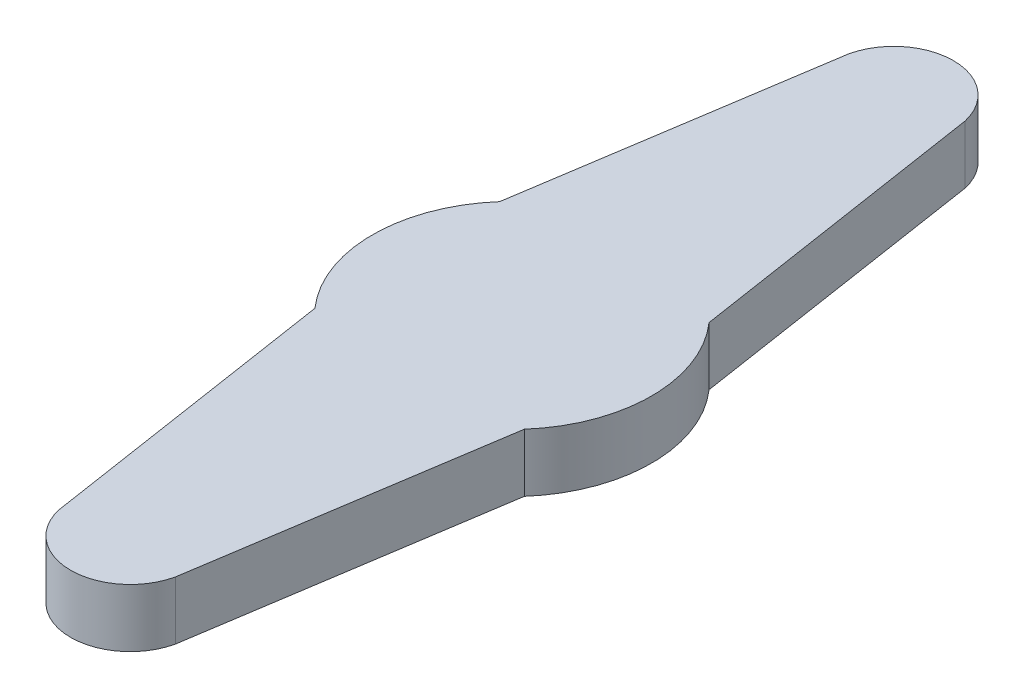
ISO-10303-21;
HEADER;
FILE_DESCRIPTION(('STEP AP214'),'2;1');
FILE_NAME('part.step','',(''),(''),'','','');
FILE_SCHEMA(('AUTOMOTIVE_DESIGN { 1 0 10303 214 1 1 1 1 }'));
ENDSEC;
DATA;
#1=APPLICATION_CONTEXT('core data for automotive mechanical design processes');
#2=APPLICATION_PROTOCOL_DEFINITION('international standard','automotive_design',2000,#1);
#3=PRODUCT_CONTEXT('',#1,'mechanical');
#4=PRODUCT('Part','Part','',(#3));
#5=PRODUCT_RELATED_PRODUCT_CATEGORY('part','',(#4));
#6=PRODUCT_DEFINITION_FORMATION('','',#4);
#7=PRODUCT_DEFINITION_CONTEXT('part definition',#1,'design');
#8=PRODUCT_DEFINITION('design','',#6,#7);
#9=PRODUCT_DEFINITION_SHAPE('','',#8);
#10=(LENGTH_UNIT() NAMED_UNIT(*) SI_UNIT(.MILLI.,.METRE.));
#11=(NAMED_UNIT(*) PLANE_ANGLE_UNIT() SI_UNIT($,.RADIAN.));
#12=(NAMED_UNIT(*) SI_UNIT($,.STERADIAN.) SOLID_ANGLE_UNIT());
#13=UNCERTAINTY_MEASURE_WITH_UNIT(LENGTH_MEASURE(1.E-05),#10,'distance_accuracy_value','');
#14=(GEOMETRIC_REPRESENTATION_CONTEXT(3) GLOBAL_UNCERTAINTY_ASSIGNED_CONTEXT((#13)) GLOBAL_UNIT_ASSIGNED_CONTEXT((#10,
#11,#12)) REPRESENTATION_CONTEXT('',''));
#15=CARTESIAN_POINT('',(0.,0.,0.));
#16=DIRECTION('',(0.,0.,1.));
#17=DIRECTION('',(1.,0.,0.));
#18=AXIS2_PLACEMENT_3D('',#15,#16,#17);
#19=CARTESIAN_POINT('',(0.,2.5,-16.4061269665969));
#20=DIRECTION('',(0.,-1.,0.));
#21=DIRECTION('',(0.,0.,-1.));
#22=AXIS2_PLACEMENT_3D('',#19,#20,#21);
#23=CYLINDRICAL_SURFACE('',#22,2.5625);
#24=CARTESIAN_POINT('',(0.,0.,-16.4061269665969));
#25=DIRECTION('',(0.,-1.,0.));
#26=DIRECTION('',(0.,0.,-1.));
#27=AXIS2_PLACEMENT_3D('',#24,#25,#26);
#28=CIRCLE('',#27,2.5625);
#29=CARTESIAN_POINT('',(-2.5,0.,-16.9686269665969));
#30=VERTEX_POINT('',#29);
#31=CARTESIAN_POINT('',(2.5,0.,-16.9686269665969));
#32=VERTEX_POINT('',#31);
#33=EDGE_CURVE('E147',#30,#32,#28,.T.);
#34=ORIENTED_EDGE('',*,*,#33,.F.);
#35=DIRECTION('',(0.,-1.,0.));
#36=VECTOR('',#35,1.);
#37=CARTESIAN_POINT('',(-2.5,2.5,-16.9686269665969));
#38=LINE('',#37,#36);
#39=CARTESIAN_POINT('',(-2.5,2.5,-16.9686269665969));
#40=VERTEX_POINT('',#39);
#41=EDGE_CURVE('E11',#40,#30,#38,.T.);
#42=ORIENTED_EDGE('',*,*,#41,.F.);
#43=CARTESIAN_POINT('',(0.,2.5,-16.4061269665969));
#44=DIRECTION('',(0.,-1.,0.));
#45=DIRECTION('',(0.,0.,-1.));
#46=AXIS2_PLACEMENT_3D('',#43,#44,#45);
#47=CIRCLE('',#46,2.5625);
#48=CARTESIAN_POINT('',(2.5,2.5,-16.9686269665969));
#49=VERTEX_POINT('',#48);
#50=EDGE_CURVE('E171',#40,#49,#47,.T.);
#51=ORIENTED_EDGE('',*,*,#50,.T.);
#52=DIRECTION('',(0.,-1.,0.));
#53=VECTOR('',#52,1.);
#54=CARTESIAN_POINT('',(2.5,2.5,-16.9686269665969));
#55=LINE('',#54,#53);
#56=EDGE_CURVE('E46',#49,#32,#55,.T.);
#57=ORIENTED_EDGE('',*,*,#56,.T.);
#58=EDGE_LOOP('',(#34,#42,#51,#57));
#59=FACE_BOUND('',#58,.T.);
#60=ADVANCED_FACE('F43',(#59),#23,.T.);
#61=CARTESIAN_POINT('',(-2.5,2.5,-16.9686269665969));
#62=DIRECTION('',(0.988371697650617,0.,0.152057184253941));
#63=DIRECTION('',(0.152057184253941,0.,-0.988371697650617));
#64=AXIS2_PLACEMENT_3D('',#61,#62,#63);
#65=PLANE('',#64);
#66=DIRECTION('',(-0.152057184253941,0.,0.988371697650617));
#67=VECTOR('',#66,1.);
#68=CARTESIAN_POINT('',(-2.5,0.,-16.9686269665969));
#69=LINE('',#68,#67);
#70=CARTESIAN_POINT('',(-4.5,0.,-3.96862696659689));
#71=VERTEX_POINT('',#70);
#72=EDGE_CURVE('E89',#30,#71,#69,.T.);
#73=ORIENTED_EDGE('',*,*,#72,.T.);
#74=DIRECTION('',(0.,-1.,0.));
#75=VECTOR('',#74,1.);
#76=CARTESIAN_POINT('',(-4.5,2.5,-3.96862696659689));
#77=LINE('',#76,#75);
#78=CARTESIAN_POINT('',(-4.5,2.5,-3.96862696659689));
#79=VERTEX_POINT('',#78);
#80=EDGE_CURVE('E53',#79,#71,#77,.T.);
#81=ORIENTED_EDGE('',*,*,#80,.F.);
#82=DIRECTION('',(-0.152057184253941,0.,0.988371697650617));
#83=VECTOR('',#82,1.);
#84=CARTESIAN_POINT('',(-2.5,2.5,-16.9686269665969));
#85=LINE('',#84,#83);
#86=EDGE_CURVE('E120',#40,#79,#85,.T.);
#87=ORIENTED_EDGE('',*,*,#86,.F.);
#88=ORIENTED_EDGE('',*,*,#41,.T.);
#89=EDGE_LOOP('',(#73,#81,#87,#88));
#90=FACE_BOUND('',#89,.T.);
#91=ADVANCED_FACE('F221',(#90),#65,.F.);
#92=CARTESIAN_POINT('',(0.,2.5,0.));
#93=DIRECTION('',(0.,-1.,0.));
#94=DIRECTION('',(0.,0.,-1.));
#95=AXIS2_PLACEMENT_3D('',#92,#93,#94);
#96=CYLINDRICAL_SURFACE('',#95,6.);
#97=CARTESIAN_POINT('',(0.,0.,0.));
#98=DIRECTION('',(0.,1.,0.));
#99=DIRECTION('',(0.,0.,1.));
#100=AXIS2_PLACEMENT_3D('',#97,#98,#99);
#101=CIRCLE('',#100,6.);
#102=CARTESIAN_POINT('',(-4.5,0.,3.96862696659689));
#103=VERTEX_POINT('',#102);
#104=EDGE_CURVE('E128',#71,#103,#101,.T.);
#105=ORIENTED_EDGE('',*,*,#104,.T.);
#106=DIRECTION('',(0.,-1.,0.));
#107=VECTOR('',#106,1.);
#108=CARTESIAN_POINT('',(-4.5,2.5,3.96862696659689));
#109=LINE('',#108,#107);
#110=CARTESIAN_POINT('',(-4.5,2.5,3.96862696659689));
#111=VERTEX_POINT('',#110);
#112=EDGE_CURVE('E125',#111,#103,#109,.T.);
#113=ORIENTED_EDGE('',*,*,#112,.F.);
#114=CARTESIAN_POINT('',(0.,2.5,0.));
#115=DIRECTION('',(0.,1.,0.));
#116=DIRECTION('',(0.,0.,1.));
#117=AXIS2_PLACEMENT_3D('',#114,#115,#116);
#118=CIRCLE('',#117,6.);
#119=EDGE_CURVE('E114',#79,#111,#118,.T.);
#120=ORIENTED_EDGE('',*,*,#119,.F.);
#121=ORIENTED_EDGE('',*,*,#80,.T.);
#122=EDGE_LOOP('',(#105,#113,#120,#121));
#123=FACE_BOUND('',#122,.T.);
#124=ADVANCED_FACE('F126',(#123),#96,.T.);
#125=CARTESIAN_POINT('',(-2.5,2.5,16.9686269665969));
#126=DIRECTION('',(-0.988371697650617,0.,0.152057184253941));
#127=DIRECTION('',(0.152057184253941,0.,0.988371697650617));
#128=AXIS2_PLACEMENT_3D('',#125,#126,#127);
#129=PLANE('',#128);
#130=DIRECTION('',(-0.152057184253941,0.,-0.988371697650617));
#131=VECTOR('',#130,1.);
#132=CARTESIAN_POINT('',(-2.5,0.,16.9686269665969));
#133=LINE('',#132,#131);
#134=CARTESIAN_POINT('',(-2.5,0.,16.9686269665969));
#135=VERTEX_POINT('',#134);
#136=EDGE_CURVE('E165',#135,#103,#133,.T.);
#137=ORIENTED_EDGE('',*,*,#136,.F.);
#138=DIRECTION('',(0.,-1.,0.));
#139=VECTOR('',#138,1.);
#140=CARTESIAN_POINT('',(-2.5,2.5,16.9686269665969));
#141=LINE('',#140,#139);
#142=CARTESIAN_POINT('',(-2.5,2.5,16.9686269665969));
#143=VERTEX_POINT('',#142);
#144=EDGE_CURVE('E133',#143,#135,#141,.T.);
#145=ORIENTED_EDGE('',*,*,#144,.F.);
#146=DIRECTION('',(-0.152057184253941,0.,-0.988371697650617));
#147=VECTOR('',#146,1.);
#148=CARTESIAN_POINT('',(-2.5,2.5,16.9686269665969));
#149=LINE('',#148,#147);
#150=EDGE_CURVE('E119',#143,#111,#149,.T.);
#151=ORIENTED_EDGE('',*,*,#150,.T.);
#152=ORIENTED_EDGE('',*,*,#112,.T.);
#153=EDGE_LOOP('',(#137,#145,#151,#152));
#154=FACE_BOUND('',#153,.T.);
#155=ADVANCED_FACE('F135',(#154),#129,.T.);
#156=CARTESIAN_POINT('',(0.,2.5,16.4061269665969));
#157=DIRECTION('',(0.,-1.,0.));
#158=DIRECTION('',(0.,0.,-1.));
#159=AXIS2_PLACEMENT_3D('',#156,#157,#158);
#160=CYLINDRICAL_SURFACE('',#159,2.5625);
#161=CARTESIAN_POINT('',(0.,0.,16.4061269665969));
#162=DIRECTION('',(0.,1.,0.));
#163=DIRECTION('',(0.,0.,1.));
#164=AXIS2_PLACEMENT_3D('',#161,#162,#163);
#165=CIRCLE('',#164,2.5625);
#166=CARTESIAN_POINT('',(2.5,0.,16.9686269665969));
#167=VERTEX_POINT('',#166);
#168=EDGE_CURVE('E162',#135,#167,#165,.T.);
#169=ORIENTED_EDGE('',*,*,#168,.T.);
#170=DIRECTION('',(0.,-1.,0.));
#171=VECTOR('',#170,1.);
#172=CARTESIAN_POINT('',(2.5,2.5,16.9686269665969));
#173=LINE('',#172,#171);
#174=CARTESIAN_POINT('',(2.5,2.5,16.9686269665969));
#175=VERTEX_POINT('',#174);
#176=EDGE_CURVE('E177',#175,#167,#173,.T.);
#177=ORIENTED_EDGE('',*,*,#176,.F.);
#178=CARTESIAN_POINT('',(0.,2.5,16.4061269665969));
#179=DIRECTION('',(0.,1.,0.));
#180=DIRECTION('',(0.,0.,1.));
#181=AXIS2_PLACEMENT_3D('',#178,#179,#180);
#182=CIRCLE('',#181,2.5625);
#183=EDGE_CURVE('E138',#143,#175,#182,.T.);
#184=ORIENTED_EDGE('',*,*,#183,.F.);
#185=ORIENTED_EDGE('',*,*,#144,.T.);
#186=EDGE_LOOP('',(#169,#177,#184,#185));
#187=FACE_BOUND('',#186,.T.);
#188=ADVANCED_FACE('F196',(#187),#160,.T.);
#189=CARTESIAN_POINT('',(2.5,2.5,16.9686269665969));
#190=DIRECTION('',(-0.988371697650617,0.,-0.152057184253941));
#191=DIRECTION('',(-0.152057184253941,0.,0.988371697650617));
#192=AXIS2_PLACEMENT_3D('',#189,#190,#191);
#193=PLANE('',#192);
#194=DIRECTION('',(0.152057184253941,0.,-0.988371697650617));
#195=VECTOR('',#194,1.);
#196=CARTESIAN_POINT('',(2.5,0.,16.9686269665969));
#197=LINE('',#196,#195);
#198=CARTESIAN_POINT('',(4.5,0.,3.96862696659689));
#199=VERTEX_POINT('',#198);
#200=EDGE_CURVE('E159',#167,#199,#197,.T.);
#201=ORIENTED_EDGE('',*,*,#200,.T.);
#202=DIRECTION('',(0.,-1.,0.));
#203=VECTOR('',#202,1.);
#204=CARTESIAN_POINT('',(4.5,2.5,3.96862696659689));
#205=LINE('',#204,#203);
#206=CARTESIAN_POINT('',(4.5,2.5,3.96862696659689));
#207=VERTEX_POINT('',#206);
#208=EDGE_CURVE('E181',#207,#199,#205,.T.);
#209=ORIENTED_EDGE('',*,*,#208,.F.);
#210=DIRECTION('',(0.152057184253941,0.,-0.988371697650617));
#211=VECTOR('',#210,1.);
#212=CARTESIAN_POINT('',(2.5,2.5,16.9686269665969));
#213=LINE('',#212,#211);
#214=EDGE_CURVE('E141',#175,#207,#213,.T.);
#215=ORIENTED_EDGE('',*,*,#214,.F.);
#216=ORIENTED_EDGE('',*,*,#176,.T.);
#217=EDGE_LOOP('',(#201,#209,#215,#216));
#218=FACE_BOUND('',#217,.T.);
#219=ADVANCED_FACE('F199',(#218),#193,.F.);
#220=CARTESIAN_POINT('',(0.,2.5,0.));
#221=DIRECTION('',(0.,-1.,0.));
#222=DIRECTION('',(0.,0.,-1.));
#223=AXIS2_PLACEMENT_3D('',#220,#221,#222);
#224=CYLINDRICAL_SURFACE('',#223,6.);
#225=CARTESIAN_POINT('',(0.,0.,0.));
#226=DIRECTION('',(0.,1.,0.));
#227=DIRECTION('',(0.,0.,1.));
#228=AXIS2_PLACEMENT_3D('',#225,#226,#227);
#229=CIRCLE('',#228,6.);
#230=CARTESIAN_POINT('',(4.5,0.,-3.96862696659689));
#231=VERTEX_POINT('',#230);
#232=EDGE_CURVE('E155',#199,#231,#229,.T.);
#233=ORIENTED_EDGE('',*,*,#232,.T.);
#234=DIRECTION('',(0.,-1.,0.));
#235=VECTOR('',#234,1.);
#236=CARTESIAN_POINT('',(4.5,2.5,-3.96862696659689));
#237=LINE('',#236,#235);
#238=CARTESIAN_POINT('',(4.5,2.5,-3.96862696659689));
#239=VERTEX_POINT('',#238);
#240=EDGE_CURVE('E184',#239,#231,#237,.T.);
#241=ORIENTED_EDGE('',*,*,#240,.F.);
#242=CARTESIAN_POINT('',(0.,2.5,0.));
#243=DIRECTION('',(0.,1.,0.));
#244=DIRECTION('',(0.,0.,1.));
#245=AXIS2_PLACEMENT_3D('',#242,#243,#244);
#246=CIRCLE('',#245,6.);
#247=EDGE_CURVE('E203',#207,#239,#246,.T.);
#248=ORIENTED_EDGE('',*,*,#247,.F.);
#249=ORIENTED_EDGE('',*,*,#208,.T.);
#250=EDGE_LOOP('',(#233,#241,#248,#249));
#251=FACE_BOUND('',#250,.T.);
#252=ADVANCED_FACE('F212',(#251),#224,.T.);
#253=CARTESIAN_POINT('',(2.5,2.5,-16.9686269665969));
#254=DIRECTION('',(0.988371697650617,0.,-0.152057184253941));
#255=DIRECTION('',(-0.152057184253941,0.,-0.988371697650617));
#256=AXIS2_PLACEMENT_3D('',#253,#254,#255);
#257=PLANE('',#256);
#258=DIRECTION('',(0.152057184253941,0.,0.988371697650617));
#259=VECTOR('',#258,1.);
#260=CARTESIAN_POINT('',(2.5,0.,-16.9686269665969));
#261=LINE('',#260,#259);
#262=EDGE_CURVE('E151',#32,#231,#261,.T.);
#263=ORIENTED_EDGE('',*,*,#262,.F.);
#264=ORIENTED_EDGE('',*,*,#56,.F.);
#265=DIRECTION('',(0.152057184253941,0.,0.988371697650617));
#266=VECTOR('',#265,1.);
#267=CARTESIAN_POINT('',(2.5,2.5,-16.9686269665969));
#268=LINE('',#267,#266);
#269=EDGE_CURVE('E205',#49,#239,#268,.T.);
#270=ORIENTED_EDGE('',*,*,#269,.T.);
#271=ORIENTED_EDGE('',*,*,#240,.T.);
#272=EDGE_LOOP('',(#263,#264,#270,#271));
#273=FACE_BOUND('',#272,.T.);
#274=ADVANCED_FACE('F188',(#273),#257,.T.);
#275=CARTESIAN_POINT('',(0.,2.5,-16.4061269665969));
#276=DIRECTION('',(0.,-1.,0.));
#277=DIRECTION('',(0.,0.,-1.));
#278=AXIS2_PLACEMENT_3D('',#275,#276,#277);
#279=PLANE('',#278);
#280=ORIENTED_EDGE('',*,*,#50,.F.);
#281=ORIENTED_EDGE('',*,*,#86,.T.);
#282=ORIENTED_EDGE('',*,*,#119,.T.);
#283=ORIENTED_EDGE('',*,*,#150,.F.);
#284=ORIENTED_EDGE('',*,*,#183,.T.);
#285=ORIENTED_EDGE('',*,*,#214,.T.);
#286=ORIENTED_EDGE('',*,*,#247,.T.);
#287=ORIENTED_EDGE('',*,*,#269,.F.);
#288=EDGE_LOOP('',(#280,#281,#282,#283,#284,#285,#286,#287));
#289=FACE_BOUND('',#288,.T.);
#290=ADVANCED_FACE('F117',(#289),#279,.F.);
#291=CARTESIAN_POINT('',(0.,0.,-16.4061269665969));
#292=DIRECTION('',(0.,-1.,0.));
#293=DIRECTION('',(0.,0.,-1.));
#294=AXIS2_PLACEMENT_3D('',#291,#292,#293);
#295=PLANE('',#294);
#296=ORIENTED_EDGE('',*,*,#33,.T.);
#297=ORIENTED_EDGE('',*,*,#262,.T.);
#298=ORIENTED_EDGE('',*,*,#232,.F.);
#299=ORIENTED_EDGE('',*,*,#200,.F.);
#300=ORIENTED_EDGE('',*,*,#168,.F.);
#301=ORIENTED_EDGE('',*,*,#136,.T.);
#302=ORIENTED_EDGE('',*,*,#104,.F.);
#303=ORIENTED_EDGE('',*,*,#72,.F.);
#304=EDGE_LOOP('',(#296,#297,#298,#299,#300,#301,#302,#303));
#305=FACE_BOUND('',#304,.T.);
#306=ADVANCED_FACE('F191',(#305),#295,.T.);
#307=CLOSED_SHELL('',(#60,#91,#124,#155,#188,#219,#252,#274,#290,#306));
#308=MANIFOLD_SOLID_BREP('B2',#307);
#309=ADVANCED_BREP_SHAPE_REPRESENTATION('',(#18,#308),#14);
#310=SHAPE_DEFINITION_REPRESENTATION(#9,#309);
ENDSEC;
END-ISO-10303-21;
